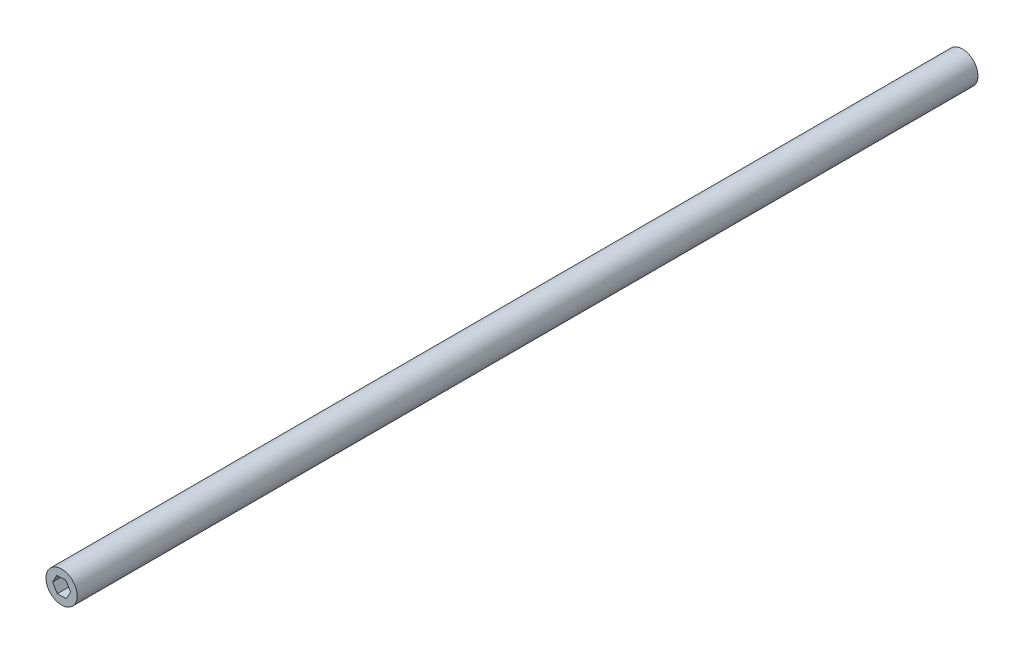
ISO-10303-21;
HEADER;
FILE_DESCRIPTION(('STEP AP214'),'2;1');
FILE_NAME('part.step','',(''),(''),'','','');
FILE_SCHEMA(('AUTOMOTIVE_DESIGN { 1 0 10303 214 1 1 1 1 }'));
ENDSEC;
DATA;
#1=APPLICATION_CONTEXT('core data for automotive mechanical design processes');
#2=APPLICATION_PROTOCOL_DEFINITION('international standard','automotive_design',2000,#1);
#3=PRODUCT_CONTEXT('',#1,'mechanical');
#4=PRODUCT('Part','Part','',(#3));
#5=PRODUCT_RELATED_PRODUCT_CATEGORY('part','',(#4));
#6=PRODUCT_DEFINITION_FORMATION('','',#4);
#7=PRODUCT_DEFINITION_CONTEXT('part definition',#1,'design');
#8=PRODUCT_DEFINITION('design','',#6,#7);
#9=PRODUCT_DEFINITION_SHAPE('','',#8);
#10=(LENGTH_UNIT() NAMED_UNIT(*) SI_UNIT(.MILLI.,.METRE.));
#11=(NAMED_UNIT(*) PLANE_ANGLE_UNIT() SI_UNIT($,.RADIAN.));
#12=(NAMED_UNIT(*) SI_UNIT($,.STERADIAN.) SOLID_ANGLE_UNIT());
#13=UNCERTAINTY_MEASURE_WITH_UNIT(LENGTH_MEASURE(1.E-05),#10,'distance_accuracy_value','');
#14=(GEOMETRIC_REPRESENTATION_CONTEXT(3) GLOBAL_UNCERTAINTY_ASSIGNED_CONTEXT((#13)) GLOBAL_UNIT_ASSIGNED_CONTEXT((#10,
#11,#12)) REPRESENTATION_CONTEXT('',''));
#15=CARTESIAN_POINT('',(0.,0.,0.));
#16=DIRECTION('',(0.,0.,1.));
#17=DIRECTION('',(1.,0.,0.));
#18=AXIS2_PLACEMENT_3D('',#15,#16,#17);
#19=CARTESIAN_POINT('',(0.,0.,732.282));
#20=DIRECTION('',(0.,0.,1.));
#21=DIRECTION('',(1.,0.,0.));
#22=AXIS2_PLACEMENT_3D('',#19,#20,#21);
#23=PLANE('',#22);
#24=CARTESIAN_POINT('',(0.,0.,732.282));
#25=DIRECTION('',(0.,0.,1.));
#26=DIRECTION('',(1.,0.,0.));
#27=AXIS2_PLACEMENT_3D('',#24,#25,#26);
#28=CIRCLE('',#27,12.7);
#29=CARTESIAN_POINT('',(12.7,0.,732.282));
#30=VERTEX_POINT('',#29);
#31=EDGE_CURVE('E11',#30,#30,#28,.T.);
#32=ORIENTED_EDGE('',*,*,#31,.T.);
#33=EDGE_LOOP('',(#32));
#34=FACE_BOUND('',#33,.T.);
#35=DIRECTION('',(0.477448037117826,0.878659986486431,0.));
#36=VECTOR('',#35,1.);
#37=CARTESIAN_POINT('',(3.82908323420071,-6.25311561694619,732.282));
#38=LINE('',#37,#36);
#39=CARTESIAN_POINT('',(3.82908323420071,-6.25311561694619,732.282));
#40=VERTEX_POINT('',#39);
#41=CARTESIAN_POINT('',(7.32989859417696,0.18952554554981,732.282));
#42=VERTEX_POINT('',#41);
#43=EDGE_CURVE('E108',#40,#42,#38,.T.);
#44=ORIENTED_EDGE('',*,*,#43,.F.);
#45=DIRECTION('',(0.999665888145054,0.0258478641121632,0.));
#46=VECTOR('',#45,1.);
#47=CARTESIAN_POINT('',(-3.50081535997625,-6.44264116249599,732.282));
#48=LINE('',#47,#46);
#49=CARTESIAN_POINT('',(-3.50081535997625,-6.44264116249599,732.282));
#50=VERTEX_POINT('',#49);
#51=EDGE_CURVE('E99',#50,#40,#48,.T.);
#52=ORIENTED_EDGE('',*,*,#51,.F.);
#53=DIRECTION('',(0.522217851027228,-0.852812122374268,0.));
#54=VECTOR('',#53,1.);
#55=CARTESIAN_POINT('',(-7.32989859417696,-0.189525545549805,732.282));
#56=LINE('',#55,#54);
#57=CARTESIAN_POINT('',(-7.32989859417696,-0.189525545549805,732.282));
#58=VERTEX_POINT('',#57);
#59=EDGE_CURVE('E133',#58,#50,#56,.T.);
#60=ORIENTED_EDGE('',*,*,#59,.F.);
#61=DIRECTION('',(-0.477448037117826,-0.878659986486431,0.));
#62=VECTOR('',#61,1.);
#63=CARTESIAN_POINT('',(-3.82908323420071,6.25311561694619,732.282));
#64=LINE('',#63,#62);
#65=CARTESIAN_POINT('',(-3.82908323420071,6.25311561694619,732.282));
#66=VERTEX_POINT('',#65);
#67=EDGE_CURVE('E130',#66,#58,#64,.T.);
#68=ORIENTED_EDGE('',*,*,#67,.F.);
#69=DIRECTION('',(-0.999665888145054,-0.0258478641121629,0.));
#70=VECTOR('',#69,1.);
#71=CARTESIAN_POINT('',(3.50081535997625,6.44264116249599,732.282));
#72=LINE('',#71,#70);
#73=CARTESIAN_POINT('',(3.50081535997625,6.44264116249599,732.282));
#74=VERTEX_POINT('',#73);
#75=EDGE_CURVE('E125',#74,#66,#72,.T.);
#76=ORIENTED_EDGE('',*,*,#75,.F.);
#77=DIRECTION('',(-0.522217851027228,0.852812122374268,0.));
#78=VECTOR('',#77,1.);
#79=CARTESIAN_POINT('',(7.32989859417696,0.18952554554981,732.282));
#80=LINE('',#79,#78);
#81=EDGE_CURVE('E121',#42,#74,#80,.T.);
#82=ORIENTED_EDGE('',*,*,#81,.F.);
#83=EDGE_LOOP('',(#44,#52,#60,#68,#76,#82));
#84=FACE_BOUND('',#83,.T.);
#85=ADVANCED_FACE('F45',(#34,#84),#23,.T.);
#86=CARTESIAN_POINT('',(0.,0.,0.));
#87=DIRECTION('',(0.,0.,1.));
#88=DIRECTION('',(1.,0.,0.));
#89=AXIS2_PLACEMENT_3D('',#86,#87,#88);
#90=PLANE('',#89);
#91=CARTESIAN_POINT('',(0.,0.,0.));
#92=DIRECTION('',(0.,0.,1.));
#93=DIRECTION('',(1.,0.,0.));
#94=AXIS2_PLACEMENT_3D('',#91,#92,#93);
#95=CIRCLE('',#94,12.7);
#96=CARTESIAN_POINT('',(12.7,0.,0.));
#97=VERTEX_POINT('',#96);
#98=EDGE_CURVE('E49',#97,#97,#95,.T.);
#99=ORIENTED_EDGE('',*,*,#98,.F.);
#100=EDGE_LOOP('',(#99));
#101=FACE_BOUND('',#100,.T.);
#102=DIRECTION('',(0.999665888145054,0.0258478641121632,0.));
#103=VECTOR('',#102,1.);
#104=CARTESIAN_POINT('',(-3.50081535997625,-6.44264116249599,0.));
#105=LINE('',#104,#103);
#106=CARTESIAN_POINT('',(-3.50081535997625,-6.44264116249599,0.));
#107=VERTEX_POINT('',#106);
#108=CARTESIAN_POINT('',(3.82908323420071,-6.25311561694619,0.));
#109=VERTEX_POINT('',#108);
#110=EDGE_CURVE('E69',#107,#109,#105,.T.);
#111=ORIENTED_EDGE('',*,*,#110,.T.);
#112=DIRECTION('',(0.477448037117826,0.878659986486431,0.));
#113=VECTOR('',#112,1.);
#114=CARTESIAN_POINT('',(3.82908323420071,-6.25311561694619,0.));
#115=LINE('',#114,#113);
#116=CARTESIAN_POINT('',(7.32989859417696,0.18952554554981,0.));
#117=VERTEX_POINT('',#116);
#118=EDGE_CURVE('E115',#109,#117,#115,.T.);
#119=ORIENTED_EDGE('',*,*,#118,.T.);
#120=DIRECTION('',(-0.522217851027228,0.852812122374268,0.));
#121=VECTOR('',#120,1.);
#122=CARTESIAN_POINT('',(7.32989859417696,0.18952554554981,0.));
#123=LINE('',#122,#121);
#124=CARTESIAN_POINT('',(3.50081535997625,6.44264116249599,0.));
#125=VERTEX_POINT('',#124);
#126=EDGE_CURVE('E140',#117,#125,#123,.T.);
#127=ORIENTED_EDGE('',*,*,#126,.T.);
#128=DIRECTION('',(-0.999665888145054,-0.0258478641121629,0.));
#129=VECTOR('',#128,1.);
#130=CARTESIAN_POINT('',(3.50081535997625,6.44264116249599,0.));
#131=LINE('',#130,#129);
#132=CARTESIAN_POINT('',(-3.82908323420071,6.25311561694619,0.));
#133=VERTEX_POINT('',#132);
#134=EDGE_CURVE('E144',#125,#133,#131,.T.);
#135=ORIENTED_EDGE('',*,*,#134,.T.);
#136=DIRECTION('',(-0.477448037117826,-0.878659986486431,0.));
#137=VECTOR('',#136,1.);
#138=CARTESIAN_POINT('',(-3.82908323420071,6.25311561694619,0.));
#139=LINE('',#138,#137);
#140=CARTESIAN_POINT('',(-7.32989859417696,-0.189525545549805,0.));
#141=VERTEX_POINT('',#140);
#142=EDGE_CURVE('E148',#133,#141,#139,.T.);
#143=ORIENTED_EDGE('',*,*,#142,.T.);
#144=DIRECTION('',(0.522217851027228,-0.852812122374268,0.));
#145=VECTOR('',#144,1.);
#146=CARTESIAN_POINT('',(-7.32989859417696,-0.189525545549805,0.));
#147=LINE('',#146,#145);
#148=EDGE_CURVE('E109',#141,#107,#147,.T.);
#149=ORIENTED_EDGE('',*,*,#148,.T.);
#150=EDGE_LOOP('',(#111,#119,#127,#135,#143,#149));
#151=FACE_BOUND('',#150,.T.);
#152=ADVANCED_FACE('F172',(#101,#151),#90,.F.);
#153=CARTESIAN_POINT('',(0.,0.,732.282));
#154=DIRECTION('',(0.,0.,-1.));
#155=DIRECTION('',(-1.,0.,0.));
#156=AXIS2_PLACEMENT_3D('',#153,#154,#155);
#157=CYLINDRICAL_SURFACE('',#156,12.7);
#158=ORIENTED_EDGE('',*,*,#31,.F.);
#159=EDGE_LOOP('',(#158));
#160=FACE_BOUND('',#159,.T.);
#161=ORIENTED_EDGE('',*,*,#98,.T.);
#162=EDGE_LOOP('',(#161));
#163=FACE_BOUND('',#162,.T.);
#164=ADVANCED_FACE('F47',(#160,#163),#157,.T.);
#165=CARTESIAN_POINT('',(-3.50081535997625,-6.44264116249599,732.282));
#166=DIRECTION('',(-0.0258478641121632,0.999665888145054,0.));
#167=DIRECTION('',(-0.999665888145054,-0.0258478641121632,0.));
#168=AXIS2_PLACEMENT_3D('',#165,#166,#167);
#169=PLANE('',#168);
#170=ORIENTED_EDGE('',*,*,#110,.F.);
#171=DIRECTION('',(0.,0.,-1.));
#172=VECTOR('',#171,1.);
#173=CARTESIAN_POINT('',(-3.50081535997625,-6.44264116249599,732.282));
#174=LINE('',#173,#172);
#175=EDGE_CURVE('E103',#50,#107,#174,.T.);
#176=ORIENTED_EDGE('',*,*,#175,.F.);
#177=ORIENTED_EDGE('',*,*,#51,.T.);
#178=DIRECTION('',(0.,0.,-1.));
#179=VECTOR('',#178,1.);
#180=CARTESIAN_POINT('',(3.82908323420071,-6.25311561694619,732.282));
#181=LINE('',#180,#179);
#182=EDGE_CURVE('E102',#40,#109,#181,.T.);
#183=ORIENTED_EDGE('',*,*,#182,.T.);
#184=EDGE_LOOP('',(#170,#176,#177,#183));
#185=FACE_BOUND('',#184,.T.);
#186=ADVANCED_FACE('F101',(#185),#169,.T.);
#187=CARTESIAN_POINT('',(3.82908323420071,-6.25311561694619,732.282));
#188=DIRECTION('',(-0.878659986486431,0.477448037117826,0.));
#189=DIRECTION('',(-0.477448037117826,-0.878659986486431,0.));
#190=AXIS2_PLACEMENT_3D('',#187,#188,#189);
#191=PLANE('',#190);
#192=ORIENTED_EDGE('',*,*,#118,.F.);
#193=ORIENTED_EDGE('',*,*,#182,.F.);
#194=ORIENTED_EDGE('',*,*,#43,.T.);
#195=DIRECTION('',(0.,0.,-1.));
#196=VECTOR('',#195,1.);
#197=CARTESIAN_POINT('',(7.32989859417696,0.18952554554981,732.282));
#198=LINE('',#197,#196);
#199=EDGE_CURVE('E117',#42,#117,#198,.T.);
#200=ORIENTED_EDGE('',*,*,#199,.T.);
#201=EDGE_LOOP('',(#192,#193,#194,#200));
#202=FACE_BOUND('',#201,.T.);
#203=ADVANCED_FACE('F112',(#202),#191,.T.);
#204=CARTESIAN_POINT('',(7.32989859417696,0.18952554554981,732.282));
#205=DIRECTION('',(-0.852812122374268,-0.522217851027228,0.));
#206=DIRECTION('',(0.522217851027228,-0.852812122374268,0.));
#207=AXIS2_PLACEMENT_3D('',#204,#205,#206);
#208=PLANE('',#207);
#209=ORIENTED_EDGE('',*,*,#126,.F.);
#210=ORIENTED_EDGE('',*,*,#199,.F.);
#211=ORIENTED_EDGE('',*,*,#81,.T.);
#212=DIRECTION('',(0.,0.,-1.));
#213=VECTOR('',#212,1.);
#214=CARTESIAN_POINT('',(3.50081535997625,6.44264116249599,732.282));
#215=LINE('',#214,#213);
#216=EDGE_CURVE('E162',#74,#125,#215,.T.);
#217=ORIENTED_EDGE('',*,*,#216,.T.);
#218=EDGE_LOOP('',(#209,#210,#211,#217));
#219=FACE_BOUND('',#218,.T.);
#220=ADVANCED_FACE('F168',(#219),#208,.T.);
#221=CARTESIAN_POINT('',(3.50081535997625,6.44264116249599,732.282));
#222=DIRECTION('',(0.0258478641121629,-0.999665888145054,0.));
#223=DIRECTION('',(0.999665888145054,0.0258478641121629,0.));
#224=AXIS2_PLACEMENT_3D('',#221,#222,#223);
#225=PLANE('',#224);
#226=ORIENTED_EDGE('',*,*,#134,.F.);
#227=ORIENTED_EDGE('',*,*,#216,.F.);
#228=ORIENTED_EDGE('',*,*,#75,.T.);
#229=DIRECTION('',(0.,0.,-1.));
#230=VECTOR('',#229,1.);
#231=CARTESIAN_POINT('',(-3.82908323420071,6.25311561694619,732.282));
#232=LINE('',#231,#230);
#233=EDGE_CURVE('E159',#66,#133,#232,.T.);
#234=ORIENTED_EDGE('',*,*,#233,.T.);
#235=EDGE_LOOP('',(#226,#227,#228,#234));
#236=FACE_BOUND('',#235,.T.);
#237=ADVANCED_FACE('F180',(#236),#225,.T.);
#238=CARTESIAN_POINT('',(-3.82908323420071,6.25311561694619,732.282));
#239=DIRECTION('',(0.878659986486431,-0.477448037117826,0.));
#240=DIRECTION('',(0.477448037117826,0.878659986486431,0.));
#241=AXIS2_PLACEMENT_3D('',#238,#239,#240);
#242=PLANE('',#241);
#243=ORIENTED_EDGE('',*,*,#142,.F.);
#244=ORIENTED_EDGE('',*,*,#233,.F.);
#245=ORIENTED_EDGE('',*,*,#67,.T.);
#246=DIRECTION('',(0.,0.,-1.));
#247=VECTOR('',#246,1.);
#248=CARTESIAN_POINT('',(-7.32989859417696,-0.189525545549805,732.282));
#249=LINE('',#248,#247);
#250=EDGE_CURVE('E61',#58,#141,#249,.T.);
#251=ORIENTED_EDGE('',*,*,#250,.T.);
#252=EDGE_LOOP('',(#243,#244,#245,#251));
#253=FACE_BOUND('',#252,.T.);
#254=ADVANCED_FACE('F178',(#253),#242,.T.);
#255=CARTESIAN_POINT('',(-7.32989859417696,-0.189525545549805,732.282));
#256=DIRECTION('',(0.852812122374268,0.522217851027228,0.));
#257=DIRECTION('',(-0.522217851027228,0.852812122374268,0.));
#258=AXIS2_PLACEMENT_3D('',#255,#256,#257);
#259=PLANE('',#258);
#260=ORIENTED_EDGE('',*,*,#148,.F.);
#261=ORIENTED_EDGE('',*,*,#250,.F.);
#262=ORIENTED_EDGE('',*,*,#59,.T.);
#263=ORIENTED_EDGE('',*,*,#175,.T.);
#264=EDGE_LOOP('',(#260,#261,#262,#263));
#265=FACE_BOUND('',#264,.T.);
#266=ADVANCED_FACE('F174',(#265),#259,.T.);
#267=CLOSED_SHELL('',(#85,#152,#164,#186,#203,#220,#237,#254,#266));
#268=MANIFOLD_SOLID_BREP('B2',#267);
#269=ADVANCED_BREP_SHAPE_REPRESENTATION('',(#18,#268),#14);
#270=SHAPE_DEFINITION_REPRESENTATION(#9,#269);
ENDSEC;
END-ISO-10303-21;
